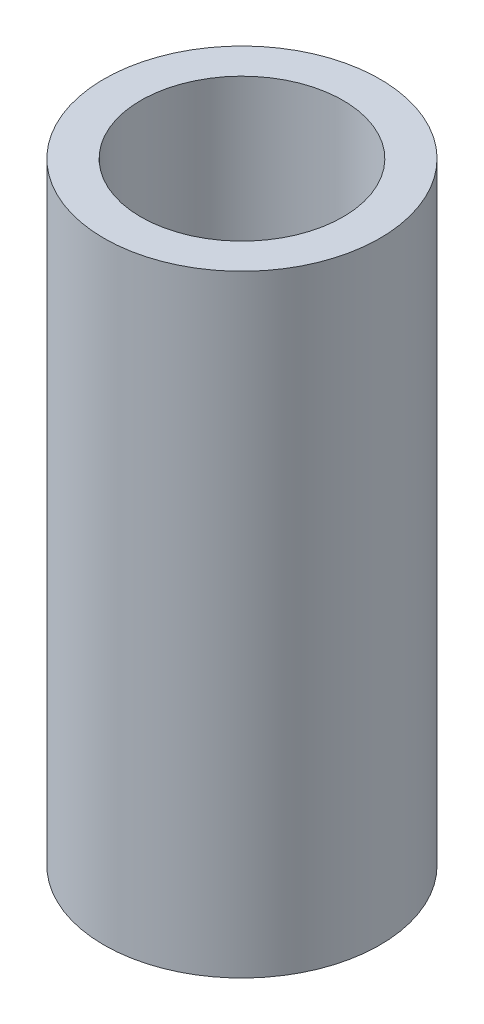
ISO-10303-21;
HEADER;
FILE_DESCRIPTION(('STEP AP214'),'2;1');
FILE_NAME('part.step','',(''),(''),'','','');
FILE_SCHEMA(('AUTOMOTIVE_DESIGN { 1 0 10303 214 1 1 1 1 }'));
ENDSEC;
DATA;
#1=APPLICATION_CONTEXT('core data for automotive mechanical design processes');
#2=APPLICATION_PROTOCOL_DEFINITION('international standard','automotive_design',2000,#1);
#3=PRODUCT_CONTEXT('',#1,'mechanical');
#4=PRODUCT('Part','Part','',(#3));
#5=PRODUCT_RELATED_PRODUCT_CATEGORY('part','',(#4));
#6=PRODUCT_DEFINITION_FORMATION('','',#4);
#7=PRODUCT_DEFINITION_CONTEXT('part definition',#1,'design');
#8=PRODUCT_DEFINITION('design','',#6,#7);
#9=PRODUCT_DEFINITION_SHAPE('','',#8);
#10=(LENGTH_UNIT() NAMED_UNIT(*) SI_UNIT(.MILLI.,.METRE.));
#11=(NAMED_UNIT(*) PLANE_ANGLE_UNIT() SI_UNIT($,.RADIAN.));
#12=(NAMED_UNIT(*) SI_UNIT($,.STERADIAN.) SOLID_ANGLE_UNIT());
#13=UNCERTAINTY_MEASURE_WITH_UNIT(LENGTH_MEASURE(1.E-05),#10,'distance_accuracy_value','');
#14=(GEOMETRIC_REPRESENTATION_CONTEXT(3) GLOBAL_UNCERTAINTY_ASSIGNED_CONTEXT((#13)) GLOBAL_UNIT_ASSIGNED_CONTEXT((#10,
#11,#12)) REPRESENTATION_CONTEXT('',''));
#15=CARTESIAN_POINT('',(0.,0.,0.));
#16=DIRECTION('',(0.,0.,1.));
#17=DIRECTION('',(1.,0.,0.));
#18=AXIS2_PLACEMENT_3D('',#15,#16,#17);
#19=CARTESIAN_POINT('',(0.,2.,0.));
#20=DIRECTION('',(0.,-1.,0.));
#21=DIRECTION('',(0.,0.,-1.));
#22=AXIS2_PLACEMENT_3D('',#19,#20,#21);
#23=CYLINDRICAL_SURFACE('',#22,0.3302);
#24=CARTESIAN_POINT('',(0.,2.,0.));
#25=DIRECTION('',(0.,1.,0.));
#26=DIRECTION('',(0.,0.,1.));
#27=AXIS2_PLACEMENT_3D('',#24,#25,#26);
#28=CIRCLE('',#27,0.3302);
#29=CARTESIAN_POINT('',(0.,2.,0.3302));
#30=VERTEX_POINT('',#29);
#31=EDGE_CURVE('E42',#30,#30,#28,.T.);
#32=ORIENTED_EDGE('',*,*,#31,.T.);
#33=EDGE_LOOP('',(#32));
#34=FACE_BOUND('',#33,.T.);
#35=CARTESIAN_POINT('',(0.,0.,0.));
#36=DIRECTION('',(0.,1.,0.));
#37=DIRECTION('',(0.,0.,1.));
#38=AXIS2_PLACEMENT_3D('',#35,#36,#37);
#39=CIRCLE('',#38,0.3302);
#40=CARTESIAN_POINT('',(0.,0.,0.3302));
#41=VERTEX_POINT('',#40);
#42=EDGE_CURVE('E48',#41,#41,#39,.T.);
#43=ORIENTED_EDGE('',*,*,#42,.F.);
#44=EDGE_LOOP('',(#43));
#45=FACE_BOUND('',#44,.T.);
#46=ADVANCED_FACE('F35',(#34,#45),#23,.F.);
#47=CARTESIAN_POINT('',(0.,2.,0.));
#48=DIRECTION('',(0.,-1.,0.));
#49=DIRECTION('',(0.,0.,-1.));
#50=AXIS2_PLACEMENT_3D('',#47,#48,#49);
#51=CYLINDRICAL_SURFACE('',#50,0.45085);
#52=CARTESIAN_POINT('',(0.,2.,0.));
#53=DIRECTION('',(0.,1.,0.));
#54=DIRECTION('',(0.,0.,1.));
#55=AXIS2_PLACEMENT_3D('',#52,#53,#54);
#56=CIRCLE('',#55,0.45085);
#57=CARTESIAN_POINT('',(0.,2.,0.45085));
#58=VERTEX_POINT('',#57);
#59=EDGE_CURVE('E10',#58,#58,#56,.T.);
#60=ORIENTED_EDGE('',*,*,#59,.F.);
#61=EDGE_LOOP('',(#60));
#62=FACE_BOUND('',#61,.T.);
#63=CARTESIAN_POINT('',(0.,0.,0.));
#64=DIRECTION('',(0.,1.,0.));
#65=DIRECTION('',(0.,0.,1.));
#66=AXIS2_PLACEMENT_3D('',#63,#64,#65);
#67=CIRCLE('',#66,0.45085);
#68=CARTESIAN_POINT('',(0.,0.,0.45085));
#69=VERTEX_POINT('',#68);
#70=EDGE_CURVE('E38',#69,#69,#67,.T.);
#71=ORIENTED_EDGE('',*,*,#70,.T.);
#72=EDGE_LOOP('',(#71));
#73=FACE_BOUND('',#72,.T.);
#74=ADVANCED_FACE('F55',(#62,#73),#51,.T.);
#75=CARTESIAN_POINT('',(0.,2.,0.));
#76=DIRECTION('',(0.,1.,0.));
#77=DIRECTION('',(0.,0.,1.));
#78=AXIS2_PLACEMENT_3D('',#75,#76,#77);
#79=PLANE('',#78);
#80=ORIENTED_EDGE('',*,*,#31,.F.);
#81=EDGE_LOOP('',(#80));
#82=FACE_BOUND('',#81,.T.);
#83=ORIENTED_EDGE('',*,*,#59,.T.);
#84=EDGE_LOOP('',(#83));
#85=FACE_BOUND('',#84,.T.);
#86=ADVANCED_FACE('F59',(#82,#85),#79,.T.);
#87=CARTESIAN_POINT('',(0.,0.,0.));
#88=DIRECTION('',(0.,1.,0.));
#89=DIRECTION('',(0.,0.,1.));
#90=AXIS2_PLACEMENT_3D('',#87,#88,#89);
#91=PLANE('',#90);
#92=ORIENTED_EDGE('',*,*,#42,.T.);
#93=EDGE_LOOP('',(#92));
#94=FACE_BOUND('',#93,.T.);
#95=ORIENTED_EDGE('',*,*,#70,.F.);
#96=EDGE_LOOP('',(#95));
#97=FACE_BOUND('',#96,.T.);
#98=ADVANCED_FACE('F57',(#94,#97),#91,.F.);
#99=CLOSED_SHELL('',(#46,#74,#86,#98));
#100=MANIFOLD_SOLID_BREP('B2',#99);
#101=ADVANCED_BREP_SHAPE_REPRESENTATION('',(#18,#100),#14);
#102=SHAPE_DEFINITION_REPRESENTATION(#9,#101);
ENDSEC;
END-ISO-10303-21;
